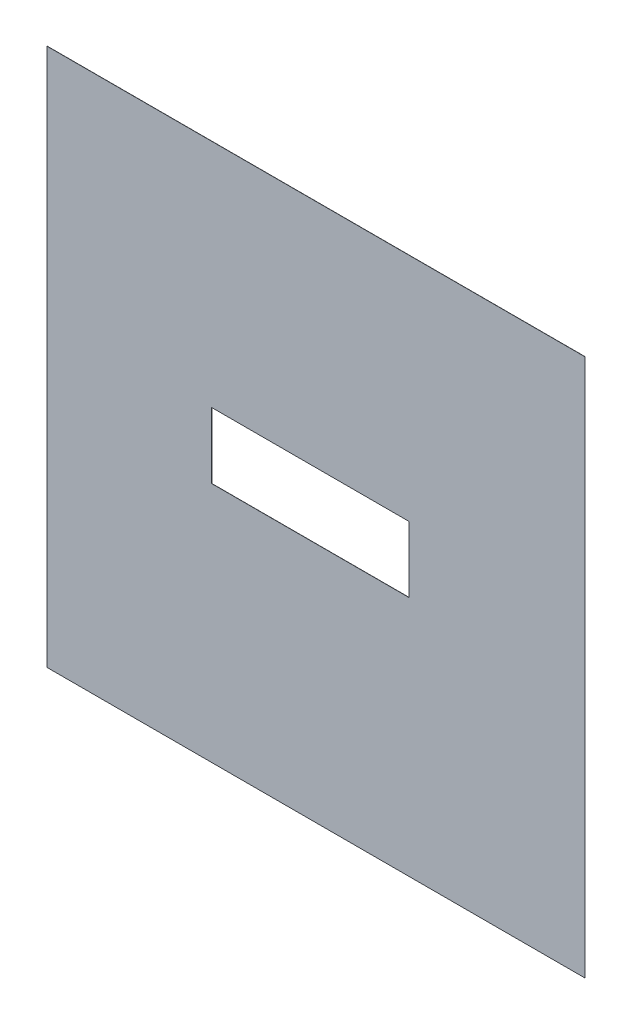
ISO-10303-21;
HEADER;
FILE_DESCRIPTION(('STEP AP214'),'2;1');
FILE_NAME('part.step','',(''),(''),'','','');
FILE_SCHEMA(('AUTOMOTIVE_DESIGN { 1 0 10303 214 1 1 1 1 }'));
ENDSEC;
DATA;
#1=APPLICATION_CONTEXT('core data for automotive mechanical design processes');
#2=APPLICATION_PROTOCOL_DEFINITION('international standard','automotive_design',2000,#1);
#3=PRODUCT_CONTEXT('',#1,'mechanical');
#4=PRODUCT('Part','Part','',(#3));
#5=PRODUCT_RELATED_PRODUCT_CATEGORY('part','',(#4));
#6=PRODUCT_DEFINITION_FORMATION('','',#4);
#7=PRODUCT_DEFINITION_CONTEXT('part definition',#1,'design');
#8=PRODUCT_DEFINITION('design','',#6,#7);
#9=PRODUCT_DEFINITION_SHAPE('','',#8);
#10=(LENGTH_UNIT() NAMED_UNIT(*) SI_UNIT(.MILLI.,.METRE.));
#11=(NAMED_UNIT(*) PLANE_ANGLE_UNIT() SI_UNIT($,.RADIAN.));
#12=(NAMED_UNIT(*) SI_UNIT($,.STERADIAN.) SOLID_ANGLE_UNIT());
#13=UNCERTAINTY_MEASURE_WITH_UNIT(LENGTH_MEASURE(1.E-05),#10,'distance_accuracy_value','');
#14=(GEOMETRIC_REPRESENTATION_CONTEXT(3) GLOBAL_UNCERTAINTY_ASSIGNED_CONTEXT((#13)) GLOBAL_UNIT_ASSIGNED_CONTEXT((#10,
#11,#12)) REPRESENTATION_CONTEXT('',''));
#15=CARTESIAN_POINT('',(0.,0.,0.));
#16=DIRECTION('',(0.,0.,1.));
#17=DIRECTION('',(1.,0.,0.));
#18=AXIS2_PLACEMENT_3D('',#15,#16,#17);
#19=CARTESIAN_POINT('',(0.,0.,0.035));
#20=DIRECTION('',(1.,0.,0.));
#21=DIRECTION('',(0.,1.,0.));
#22=AXIS2_PLACEMENT_3D('',#19,#20,#21);
#23=PLANE('',#22);
#24=DIRECTION('',(0.,-1.,0.));
#25=VECTOR('',#24,1.);
#26=CARTESIAN_POINT('',(0.,0.,0.));
#27=LINE('',#26,#25);
#28=CARTESIAN_POINT('',(0.,0.,0.));
#29=VERTEX_POINT('',#28);
#30=CARTESIAN_POINT('',(0.,-98.,0.));
#31=VERTEX_POINT('',#30);
#32=EDGE_CURVE('E140',#29,#31,#27,.T.);
#33=ORIENTED_EDGE('',*,*,#32,.T.);
#34=DIRECTION('',(0.,0.,-1.));
#35=VECTOR('',#34,1.);
#36=CARTESIAN_POINT('',(0.,-98.,0.035));
#37=LINE('',#36,#35);
#38=CARTESIAN_POINT('',(0.,-98.,0.035));
#39=VERTEX_POINT('',#38);
#40=EDGE_CURVE('E11',#39,#31,#37,.T.);
#41=ORIENTED_EDGE('',*,*,#40,.F.);
#42=DIRECTION('',(0.,-1.,0.));
#43=VECTOR('',#42,1.);
#44=CARTESIAN_POINT('',(0.,0.,0.035));
#45=LINE('',#44,#43);
#46=CARTESIAN_POINT('',(0.,0.,0.035));
#47=VERTEX_POINT('',#46);
#48=EDGE_CURVE('E141',#47,#39,#45,.T.);
#49=ORIENTED_EDGE('',*,*,#48,.F.);
#50=DIRECTION('',(0.,0.,-1.));
#51=VECTOR('',#50,1.);
#52=CARTESIAN_POINT('',(0.,0.,0.035));
#53=LINE('',#52,#51);
#54=EDGE_CURVE('E151',#47,#29,#53,.T.);
#55=ORIENTED_EDGE('',*,*,#54,.T.);
#56=EDGE_LOOP('',(#33,#41,#49,#55));
#57=FACE_BOUND('',#56,.T.);
#58=ADVANCED_FACE('F41',(#57),#23,.F.);
#59=CARTESIAN_POINT('',(0.,-98.,0.035));
#60=DIRECTION('',(0.,1.,0.));
#61=DIRECTION('',(0.,0.,1.));
#62=AXIS2_PLACEMENT_3D('',#59,#60,#61);
#63=PLANE('',#62);
#64=DIRECTION('',(1.,0.,0.));
#65=VECTOR('',#64,1.);
#66=CARTESIAN_POINT('',(0.,-98.,0.));
#67=LINE('',#66,#65);
#68=CARTESIAN_POINT('',(98.,-98.,0.));
#69=VERTEX_POINT('',#68);
#70=EDGE_CURVE('E154',#31,#69,#67,.T.);
#71=ORIENTED_EDGE('',*,*,#70,.T.);
#72=DIRECTION('',(0.,0.,-1.));
#73=VECTOR('',#72,1.);
#74=CARTESIAN_POINT('',(98.,-98.,0.035));
#75=LINE('',#74,#73);
#76=CARTESIAN_POINT('',(98.,-98.,0.035));
#77=VERTEX_POINT('',#76);
#78=EDGE_CURVE('E48',#77,#69,#75,.T.);
#79=ORIENTED_EDGE('',*,*,#78,.F.);
#80=DIRECTION('',(1.,0.,0.));
#81=VECTOR('',#80,1.);
#82=CARTESIAN_POINT('',(0.,-98.,0.035));
#83=LINE('',#82,#81);
#84=EDGE_CURVE('E144',#39,#77,#83,.T.);
#85=ORIENTED_EDGE('',*,*,#84,.F.);
#86=ORIENTED_EDGE('',*,*,#40,.T.);
#87=EDGE_LOOP('',(#71,#79,#85,#86));
#88=FACE_BOUND('',#87,.T.);
#89=ADVANCED_FACE('F182',(#88),#63,.F.);
#90=CARTESIAN_POINT('',(98.,0.,0.035));
#91=DIRECTION('',(-1.,0.,0.));
#92=DIRECTION('',(0.,-1.,0.));
#93=AXIS2_PLACEMENT_3D('',#90,#91,#92);
#94=PLANE('',#93);
#95=DIRECTION('',(0.,1.,0.));
#96=VECTOR('',#95,1.);
#97=CARTESIAN_POINT('',(98.,0.,0.));
#98=LINE('',#97,#96);
#99=CARTESIAN_POINT('',(98.,0.,0.));
#100=VERTEX_POINT('',#99);
#101=EDGE_CURVE('E156',#69,#100,#98,.T.);
#102=ORIENTED_EDGE('',*,*,#101,.T.);
#103=DIRECTION('',(0.,0.,-1.));
#104=VECTOR('',#103,1.);
#105=CARTESIAN_POINT('',(98.,0.,0.035));
#106=LINE('',#105,#104);
#107=CARTESIAN_POINT('',(98.,0.,0.035));
#108=VERTEX_POINT('',#107);
#109=EDGE_CURVE('E161',#108,#100,#106,.T.);
#110=ORIENTED_EDGE('',*,*,#109,.F.);
#111=DIRECTION('',(0.,1.,0.));
#112=VECTOR('',#111,1.);
#113=CARTESIAN_POINT('',(98.,0.,0.035));
#114=LINE('',#113,#112);
#115=EDGE_CURVE('E147',#77,#108,#114,.T.);
#116=ORIENTED_EDGE('',*,*,#115,.F.);
#117=ORIENTED_EDGE('',*,*,#78,.T.);
#118=EDGE_LOOP('',(#102,#110,#116,#117));
#119=FACE_BOUND('',#118,.T.);
#120=ADVANCED_FACE('F168',(#119),#94,.F.);
#121=CARTESIAN_POINT('',(0.,0.,0.035));
#122=DIRECTION('',(0.,-1.,0.));
#123=DIRECTION('',(0.,0.,-1.));
#124=AXIS2_PLACEMENT_3D('',#121,#122,#123);
#125=PLANE('',#124);
#126=DIRECTION('',(-1.,0.,0.));
#127=VECTOR('',#126,1.);
#128=CARTESIAN_POINT('',(0.,0.,0.));
#129=LINE('',#128,#127);
#130=EDGE_CURVE('E145',#100,#29,#129,.T.);
#131=ORIENTED_EDGE('',*,*,#130,.T.);
#132=ORIENTED_EDGE('',*,*,#54,.F.);
#133=DIRECTION('',(-1.,0.,0.));
#134=VECTOR('',#133,1.);
#135=CARTESIAN_POINT('',(0.,0.,0.035));
#136=LINE('',#135,#134);
#137=EDGE_CURVE('E149',#108,#47,#136,.T.);
#138=ORIENTED_EDGE('',*,*,#137,.F.);
#139=ORIENTED_EDGE('',*,*,#109,.T.);
#140=EDGE_LOOP('',(#131,#132,#138,#139));
#141=FACE_BOUND('',#140,.T.);
#142=ADVANCED_FACE('F175',(#141),#125,.F.);
#143=CARTESIAN_POINT('',(0.,-98.,0.035));
#144=DIRECTION('',(0.,0.,1.));
#145=DIRECTION('',(1.,0.,0.));
#146=AXIS2_PLACEMENT_3D('',#143,#144,#145);
#147=PLANE('',#146);
#148=DIRECTION('',(0.,1.,0.));
#149=VECTOR('',#148,1.);
#150=CARTESIAN_POINT('',(66.,-98.,0.035));
#151=LINE('',#150,#149);
#152=CARTESIAN_POINT('',(66.,-54.,0.0350000000000003));
#153=VERTEX_POINT('',#152);
#154=CARTESIAN_POINT('',(66.,-42.,0.0350000000000003));
#155=VERTEX_POINT('',#154);
#156=EDGE_CURVE('E138',#153,#155,#151,.T.);
#157=ORIENTED_EDGE('',*,*,#156,.F.);
#158=DIRECTION('',(1.,0.,0.));
#159=VECTOR('',#158,1.);
#160=CARTESIAN_POINT('',(0.,-54.,0.035));
#161=LINE('',#160,#159);
#162=CARTESIAN_POINT('',(30.,-54.,0.035));
#163=VERTEX_POINT('',#162);
#164=EDGE_CURVE('E131',#163,#153,#161,.T.);
#165=ORIENTED_EDGE('',*,*,#164,.F.);
#166=DIRECTION('',(0.,-1.,0.));
#167=VECTOR('',#166,1.);
#168=CARTESIAN_POINT('',(30.,-98.,0.035));
#169=LINE('',#168,#167);
#170=CARTESIAN_POINT('',(30.,-42.,0.0350000000000003));
#171=VERTEX_POINT('',#170);
#172=EDGE_CURVE('E111',#171,#163,#169,.T.);
#173=ORIENTED_EDGE('',*,*,#172,.F.);
#174=DIRECTION('',(-1.,0.,0.));
#175=VECTOR('',#174,1.);
#176=CARTESIAN_POINT('',(0.,-42.,0.035));
#177=LINE('',#176,#175);
#178=EDGE_CURVE('E136',#155,#171,#177,.T.);
#179=ORIENTED_EDGE('',*,*,#178,.F.);
#180=EDGE_LOOP('',(#157,#165,#173,#179));
#181=FACE_BOUND('',#180,.T.);
#182=ORIENTED_EDGE('',*,*,#48,.T.);
#183=ORIENTED_EDGE('',*,*,#84,.T.);
#184=ORIENTED_EDGE('',*,*,#115,.T.);
#185=ORIENTED_EDGE('',*,*,#137,.T.);
#186=EDGE_LOOP('',(#182,#183,#184,#185));
#187=FACE_BOUND('',#186,.T.);
#188=ADVANCED_FACE('F181',(#181,#187),#147,.T.);
#189=CARTESIAN_POINT('',(0.,-98.,0.));
#190=DIRECTION('',(0.,0.,1.));
#191=DIRECTION('',(1.,0.,0.));
#192=AXIS2_PLACEMENT_3D('',#189,#190,#191);
#193=PLANE('',#192);
#194=DIRECTION('',(-1.,0.,0.));
#195=VECTOR('',#194,1.);
#196=CARTESIAN_POINT('',(66.,-54.,0.));
#197=LINE('',#196,#195);
#198=CARTESIAN_POINT('',(66.,-54.,0.));
#199=VERTEX_POINT('',#198);
#200=CARTESIAN_POINT('',(30.,-54.,0.));
#201=VERTEX_POINT('',#200);
#202=EDGE_CURVE('E117',#199,#201,#197,.T.);
#203=ORIENTED_EDGE('',*,*,#202,.F.);
#204=DIRECTION('',(0.,-1.,0.));
#205=VECTOR('',#204,1.);
#206=CARTESIAN_POINT('',(66.,-42.,0.));
#207=LINE('',#206,#205);
#208=CARTESIAN_POINT('',(66.,-42.,0.));
#209=VERTEX_POINT('',#208);
#210=EDGE_CURVE('E63',#209,#199,#207,.T.);
#211=ORIENTED_EDGE('',*,*,#210,.F.);
#212=DIRECTION('',(1.,0.,0.));
#213=VECTOR('',#212,1.);
#214=CARTESIAN_POINT('',(66.,-42.,0.));
#215=LINE('',#214,#213);
#216=CARTESIAN_POINT('',(30.,-42.,0.));
#217=VERTEX_POINT('',#216);
#218=EDGE_CURVE('E124',#217,#209,#215,.T.);
#219=ORIENTED_EDGE('',*,*,#218,.F.);
#220=DIRECTION('',(0.,1.,0.));
#221=VECTOR('',#220,1.);
#222=CARTESIAN_POINT('',(30.,-42.,0.));
#223=LINE('',#222,#221);
#224=EDGE_CURVE('E108',#201,#217,#223,.T.);
#225=ORIENTED_EDGE('',*,*,#224,.F.);
#226=EDGE_LOOP('',(#203,#211,#219,#225));
#227=FACE_BOUND('',#226,.T.);
#228=ORIENTED_EDGE('',*,*,#32,.F.);
#229=ORIENTED_EDGE('',*,*,#130,.F.);
#230=ORIENTED_EDGE('',*,*,#101,.F.);
#231=ORIENTED_EDGE('',*,*,#70,.F.);
#232=EDGE_LOOP('',(#228,#229,#230,#231));
#233=FACE_BOUND('',#232,.T.);
#234=ADVANCED_FACE('F121',(#227,#233),#193,.F.);
#235=CARTESIAN_POINT('',(66.,-42.,10.));
#236=DIRECTION('',(1.,0.,0.));
#237=DIRECTION('',(0.,0.,-1.));
#238=AXIS2_PLACEMENT_3D('',#235,#236,#237);
#239=PLANE('',#238);
#240=ORIENTED_EDGE('',*,*,#156,.T.);
#241=DIRECTION('',(0.,0.,-1.));
#242=VECTOR('',#241,1.);
#243=CARTESIAN_POINT('',(66.,-42.,10.));
#244=LINE('',#243,#242);
#245=EDGE_CURVE('E129',#155,#209,#244,.T.);
#246=ORIENTED_EDGE('',*,*,#245,.T.);
#247=ORIENTED_EDGE('',*,*,#210,.T.);
#248=DIRECTION('',(0.,0.,-1.));
#249=VECTOR('',#248,1.);
#250=CARTESIAN_POINT('',(66.,-54.,10.));
#251=LINE('',#250,#249);
#252=EDGE_CURVE('E114',#153,#199,#251,.T.);
#253=ORIENTED_EDGE('',*,*,#252,.F.);
#254=EDGE_LOOP('',(#240,#246,#247,#253));
#255=FACE_BOUND('',#254,.T.);
#256=ADVANCED_FACE('F194',(#255),#239,.F.);
#257=CARTESIAN_POINT('',(66.,-42.,10.));
#258=DIRECTION('',(0.,1.,0.));
#259=DIRECTION('',(0.,0.,1.));
#260=AXIS2_PLACEMENT_3D('',#257,#258,#259);
#261=PLANE('',#260);
#262=ORIENTED_EDGE('',*,*,#178,.T.);
#263=DIRECTION('',(0.,0.,-1.));
#264=VECTOR('',#263,1.);
#265=CARTESIAN_POINT('',(30.,-42.,10.));
#266=LINE('',#265,#264);
#267=EDGE_CURVE('E113',#171,#217,#266,.T.);
#268=ORIENTED_EDGE('',*,*,#267,.T.);
#269=ORIENTED_EDGE('',*,*,#218,.T.);
#270=ORIENTED_EDGE('',*,*,#245,.F.);
#271=EDGE_LOOP('',(#262,#268,#269,#270));
#272=FACE_BOUND('',#271,.T.);
#273=ADVANCED_FACE('F200',(#272),#261,.F.);
#274=CARTESIAN_POINT('',(30.,-42.,10.));
#275=DIRECTION('',(-1.,0.,0.));
#276=DIRECTION('',(0.,0.,1.));
#277=AXIS2_PLACEMENT_3D('',#274,#275,#276);
#278=PLANE('',#277);
#279=ORIENTED_EDGE('',*,*,#172,.T.);
#280=DIRECTION('',(0.,0.,-1.));
#281=VECTOR('',#280,1.);
#282=CARTESIAN_POINT('',(30.,-54.,10.));
#283=LINE('',#282,#281);
#284=EDGE_CURVE('E55',#163,#201,#283,.T.);
#285=ORIENTED_EDGE('',*,*,#284,.T.);
#286=ORIENTED_EDGE('',*,*,#224,.T.);
#287=ORIENTED_EDGE('',*,*,#267,.F.);
#288=EDGE_LOOP('',(#279,#285,#286,#287));
#289=FACE_BOUND('',#288,.T.);
#290=ADVANCED_FACE('F105',(#289),#278,.F.);
#291=CARTESIAN_POINT('',(66.,-54.,10.));
#292=DIRECTION('',(0.,-1.,0.));
#293=DIRECTION('',(0.,0.,-1.));
#294=AXIS2_PLACEMENT_3D('',#291,#292,#293);
#295=PLANE('',#294);
#296=ORIENTED_EDGE('',*,*,#164,.T.);
#297=ORIENTED_EDGE('',*,*,#252,.T.);
#298=ORIENTED_EDGE('',*,*,#202,.T.);
#299=ORIENTED_EDGE('',*,*,#284,.F.);
#300=EDGE_LOOP('',(#296,#297,#298,#299));
#301=FACE_BOUND('',#300,.T.);
#302=ADVANCED_FACE('F118',(#301),#295,.F.);
#303=CLOSED_SHELL('',(#58,#89,#120,#142,#188,#234,#256,#273,#290,#302));
#304=MANIFOLD_SOLID_BREP('B2',#303);
#305=ADVANCED_BREP_SHAPE_REPRESENTATION('',(#18,#304),#14);
#306=SHAPE_DEFINITION_REPRESENTATION(#9,#305);
ENDSEC;
END-ISO-10303-21;
